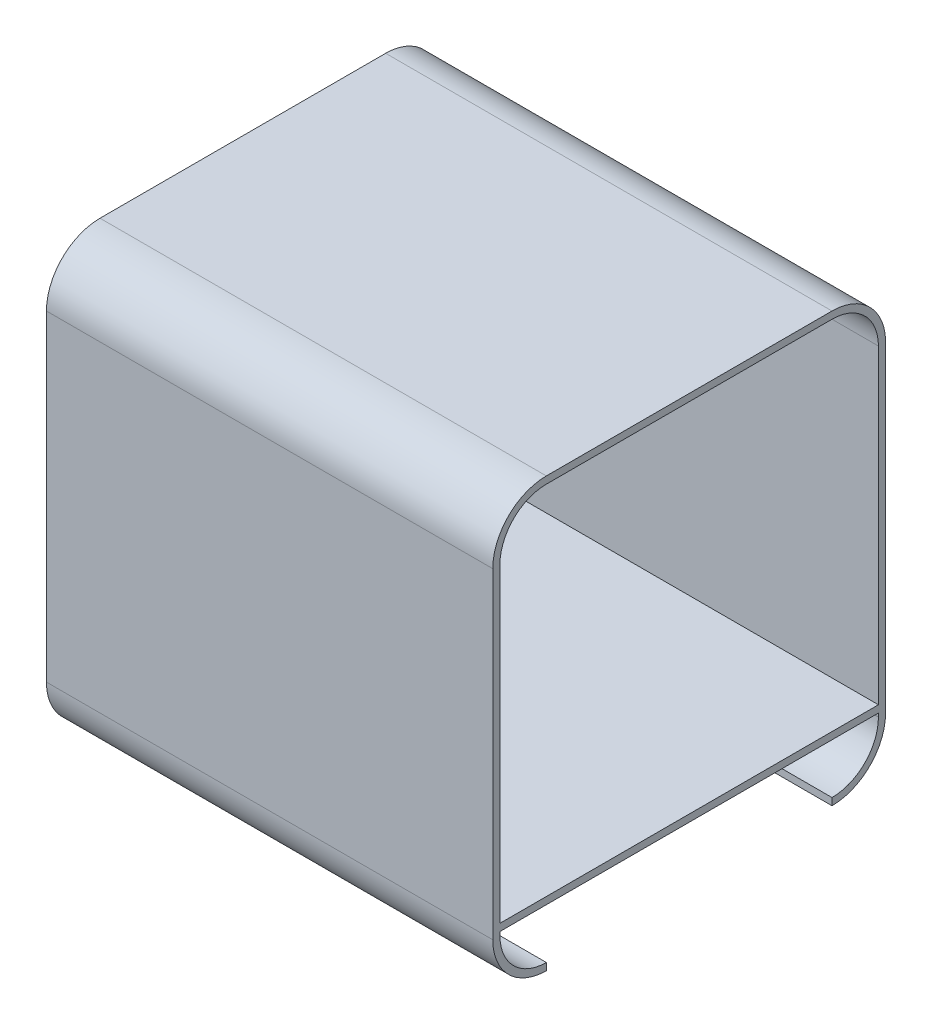
ISO-10303-21;
HEADER;
FILE_DESCRIPTION(('STEP AP214'),'2;1');
FILE_NAME('part.step','',(''),(''),'','','');
FILE_SCHEMA(('AUTOMOTIVE_DESIGN { 1 0 10303 214 1 1 1 1 }'));
ENDSEC;
DATA;
#1=APPLICATION_CONTEXT('core data for automotive mechanical design processes');
#2=APPLICATION_PROTOCOL_DEFINITION('international standard','automotive_design',2000,#1);
#3=PRODUCT_CONTEXT('',#1,'mechanical');
#4=PRODUCT('Part','Part','',(#3));
#5=PRODUCT_RELATED_PRODUCT_CATEGORY('part','',(#4));
#6=PRODUCT_DEFINITION_FORMATION('','',#4);
#7=PRODUCT_DEFINITION_CONTEXT('part definition',#1,'design');
#8=PRODUCT_DEFINITION('design','',#6,#7);
#9=PRODUCT_DEFINITION_SHAPE('','',#8);
#10=(LENGTH_UNIT() NAMED_UNIT(*) SI_UNIT(.MILLI.,.METRE.));
#11=(NAMED_UNIT(*) PLANE_ANGLE_UNIT() SI_UNIT($,.RADIAN.));
#12=(NAMED_UNIT(*) SI_UNIT($,.STERADIAN.) SOLID_ANGLE_UNIT());
#13=UNCERTAINTY_MEASURE_WITH_UNIT(LENGTH_MEASURE(1.E-05),#10,'distance_accuracy_value','');
#14=(GEOMETRIC_REPRESENTATION_CONTEXT(3) GLOBAL_UNCERTAINTY_ASSIGNED_CONTEXT((#13)) GLOBAL_UNIT_ASSIGNED_CONTEXT((#10,
#11,#12)) REPRESENTATION_CONTEXT('',''));
#15=CARTESIAN_POINT('',(0.,0.,0.));
#16=DIRECTION('',(0.,0.,1.));
#17=DIRECTION('',(1.,0.,0.));
#18=AXIS2_PLACEMENT_3D('',#15,#16,#17);
#19=CARTESIAN_POINT('',(3600.,1388.01094476767,-1100.));
#20=DIRECTION('',(-1.,0.,0.));
#21=DIRECTION('',(0.,0.,1.));
#22=AXIS2_PLACEMENT_3D('',#19,#20,#21);
#23=PLANE('',#22);
#24=DIRECTION('',(0.,0.,-1.));
#25=VECTOR('',#24,1.);
#26=CARTESIAN_POINT('',(3600.,1160.,1100.));
#27=LINE('',#26,#25);
#28=CARTESIAN_POINT('',(3600.,1160.,800.));
#29=VERTEX_POINT('',#28);
#30=CARTESIAN_POINT('',(3600.,1160.,-800.));
#31=VERTEX_POINT('',#30);
#32=EDGE_CURVE('E177',#29,#31,#27,.T.);
#33=ORIENTED_EDGE('',*,*,#32,.F.);
#34=CARTESIAN_POINT('',(3600.,900.,800.));
#35=DIRECTION('',(-1.,0.,0.));
#36=DIRECTION('',(0.,0.,1.));
#37=AXIS2_PLACEMENT_3D('',#34,#35,#36);
#38=CIRCLE('',#37,260.);
#39=CARTESIAN_POINT('',(3600.,900.,1060.));
#40=VERTEX_POINT('',#39);
#41=EDGE_CURVE('E190',#29,#40,#38,.F.);
#42=ORIENTED_EDGE('',*,*,#41,.T.);
#43=DIRECTION('',(0.,1.,0.));
#44=VECTOR('',#43,1.);
#45=CARTESIAN_POINT('',(3600.,1200.,1060.));
#46=LINE('',#45,#44);
#47=CARTESIAN_POINT('',(3600.,-840.,1060.));
#48=VERTEX_POINT('',#47);
#49=EDGE_CURVE('E262',#48,#40,#46,.T.);
#50=ORIENTED_EDGE('',*,*,#49,.F.);
#51=DIRECTION('',(0.,0.,1.));
#52=VECTOR('',#51,1.);
#53=CARTESIAN_POINT('',(3600.,-840.,-1060.));
#54=LINE('',#53,#52);
#55=CARTESIAN_POINT('',(3600.,-840.,-1060.));
#56=VERTEX_POINT('',#55);
#57=EDGE_CURVE('E39',#56,#48,#54,.T.);
#58=ORIENTED_EDGE('',*,*,#57,.F.);
#59=DIRECTION('',(0.,-1.,0.));
#60=VECTOR('',#59,1.);
#61=CARTESIAN_POINT('',(3600.,1200.,-1060.));
#62=LINE('',#61,#60);
#63=CARTESIAN_POINT('',(3600.,900.,-1060.));
#64=VERTEX_POINT('',#63);
#65=EDGE_CURVE('E264',#64,#56,#62,.T.);
#66=ORIENTED_EDGE('',*,*,#65,.F.);
#67=CARTESIAN_POINT('',(3600.,900.,-800.));
#68=DIRECTION('',(-1.,0.,0.));
#69=DIRECTION('',(0.,0.,1.));
#70=AXIS2_PLACEMENT_3D('',#67,#68,#69);
#71=CIRCLE('',#70,260.);
#72=EDGE_CURVE('E193',#64,#31,#71,.F.);
#73=ORIENTED_EDGE('',*,*,#72,.T.);
#74=EDGE_LOOP('',(#33,#42,#50,#58,#66,#73));
#75=FACE_BOUND('',#74,.T.);
#76=CARTESIAN_POINT('',(3600.,900.,-800.));
#77=DIRECTION('',(-1.,0.,0.));
#78=DIRECTION('',(0.,0.,1.));
#79=AXIS2_PLACEMENT_3D('',#76,#77,#78);
#80=CIRCLE('',#79,300.);
#81=CARTESIAN_POINT('',(3600.,900.,-1100.));
#82=VERTEX_POINT('',#81);
#83=CARTESIAN_POINT('',(3600.,1200.,-800.));
#84=VERTEX_POINT('',#83);
#85=EDGE_CURVE('E250',#82,#84,#80,.F.);
#86=ORIENTED_EDGE('',*,*,#85,.F.);
#87=DIRECTION('',(0.,-1.,0.));
#88=VECTOR('',#87,1.);
#89=CARTESIAN_POINT('',(3600.,1200.,-1100.));
#90=LINE('',#89,#88);
#91=CARTESIAN_POINT('',(3600.,-900.,-1100.));
#92=VERTEX_POINT('',#91);
#93=EDGE_CURVE('E235',#82,#92,#90,.T.);
#94=ORIENTED_EDGE('',*,*,#93,.T.);
#95=CARTESIAN_POINT('',(3600.,-900.,-800.));
#96=DIRECTION('',(-1.,0.,0.));
#97=DIRECTION('',(0.,0.,1.));
#98=AXIS2_PLACEMENT_3D('',#95,#96,#97);
#99=CIRCLE('',#98,300.);
#100=CARTESIAN_POINT('',(3600.,-1200.,-800.));
#101=VERTEX_POINT('',#100);
#102=EDGE_CURVE('E247',#101,#92,#99,.F.);
#103=ORIENTED_EDGE('',*,*,#102,.F.);
#104=DIRECTION('',(0.,1.,0.));
#105=VECTOR('',#104,1.);
#106=CARTESIAN_POINT('',(3600.,-1200.,-800.));
#107=LINE('',#106,#105);
#108=CARTESIAN_POINT('',(3600.,-1160.,-800.));
#109=VERTEX_POINT('',#108);
#110=EDGE_CURVE('E223',#101,#109,#107,.T.);
#111=ORIENTED_EDGE('',*,*,#110,.T.);
#112=CARTESIAN_POINT('',(3600.,-900.,-800.));
#113=DIRECTION('',(-1.,0.,0.));
#114=DIRECTION('',(0.,0.,1.));
#115=AXIS2_PLACEMENT_3D('',#112,#113,#114);
#116=CIRCLE('',#115,260.);
#117=CARTESIAN_POINT('',(3600.,-899.999999999999,-1060.));
#118=VERTEX_POINT('',#117);
#119=EDGE_CURVE('E215',#109,#118,#116,.F.);
#120=ORIENTED_EDGE('',*,*,#119,.T.);
#121=DIRECTION('',(0.,-1.,0.));
#122=VECTOR('',#121,1.);
#123=CARTESIAN_POINT('',(3600.,1200.,-1060.));
#124=LINE('',#123,#122);
#125=CARTESIAN_POINT('',(3600.,-880.,-1060.));
#126=VERTEX_POINT('',#125);
#127=EDGE_CURVE('E239',#126,#118,#124,.T.);
#128=ORIENTED_EDGE('',*,*,#127,.F.);
#129=DIRECTION('',(0.,0.,-1.));
#130=VECTOR('',#129,1.);
#131=CARTESIAN_POINT('',(3600.,-880.,-1060.));
#132=LINE('',#131,#130);
#133=CARTESIAN_POINT('',(3600.,-880.,1060.));
#134=VERTEX_POINT('',#133);
#135=EDGE_CURVE('E260',#134,#126,#132,.T.);
#136=ORIENTED_EDGE('',*,*,#135,.F.);
#137=DIRECTION('',(0.,1.,0.));
#138=VECTOR('',#137,1.);
#139=CARTESIAN_POINT('',(3600.,1200.,1060.));
#140=LINE('',#139,#138);
#141=CARTESIAN_POINT('',(3600.,-900.,1060.));
#142=VERTEX_POINT('',#141);
#143=EDGE_CURVE('E243',#142,#134,#140,.T.);
#144=ORIENTED_EDGE('',*,*,#143,.F.);
#145=CARTESIAN_POINT('',(3600.,-900.,800.));
#146=DIRECTION('',(-1.,0.,0.));
#147=DIRECTION('',(0.,0.,1.));
#148=AXIS2_PLACEMENT_3D('',#145,#146,#147);
#149=CIRCLE('',#148,260.);
#150=CARTESIAN_POINT('',(3600.,-1160.,800.));
#151=VERTEX_POINT('',#150);
#152=EDGE_CURVE('E211',#142,#151,#149,.F.);
#153=ORIENTED_EDGE('',*,*,#152,.T.);
#154=DIRECTION('',(0.,1.,0.));
#155=VECTOR('',#154,1.);
#156=CARTESIAN_POINT('',(3600.,-1200.,800.));
#157=LINE('',#156,#155);
#158=CARTESIAN_POINT('',(3600.,-1200.,800.));
#159=VERTEX_POINT('',#158);
#160=EDGE_CURVE('E219',#151,#159,#157,.F.);
#161=ORIENTED_EDGE('',*,*,#160,.T.);
#162=CARTESIAN_POINT('',(3600.,-900.,800.));
#163=DIRECTION('',(-1.,0.,0.));
#164=DIRECTION('',(0.,0.,1.));
#165=AXIS2_PLACEMENT_3D('',#162,#163,#164);
#166=CIRCLE('',#165,300.);
#167=CARTESIAN_POINT('',(3600.,-900.,1100.));
#168=VERTEX_POINT('',#167);
#169=EDGE_CURVE('E253',#168,#159,#166,.F.);
#170=ORIENTED_EDGE('',*,*,#169,.F.);
#171=DIRECTION('',(0.,1.,0.));
#172=VECTOR('',#171,1.);
#173=CARTESIAN_POINT('',(3600.,1200.,1100.));
#174=LINE('',#173,#172);
#175=CARTESIAN_POINT('',(3600.,900.,1100.));
#176=VERTEX_POINT('',#175);
#177=EDGE_CURVE('E231',#168,#176,#174,.T.);
#178=ORIENTED_EDGE('',*,*,#177,.T.);
#179=CARTESIAN_POINT('',(3600.,900.,800.));
#180=DIRECTION('',(-1.,0.,0.));
#181=DIRECTION('',(0.,0.,1.));
#182=AXIS2_PLACEMENT_3D('',#179,#180,#181);
#183=CIRCLE('',#182,300.);
#184=CARTESIAN_POINT('',(3600.,1200.,800.));
#185=VERTEX_POINT('',#184);
#186=EDGE_CURVE('E257',#185,#176,#183,.F.);
#187=ORIENTED_EDGE('',*,*,#186,.F.);
#188=DIRECTION('',(0.,0.,-1.));
#189=VECTOR('',#188,1.);
#190=CARTESIAN_POINT('',(3600.,1200.,1100.));
#191=LINE('',#190,#189);
#192=EDGE_CURVE('E227',#185,#84,#191,.T.);
#193=ORIENTED_EDGE('',*,*,#192,.T.);
#194=EDGE_LOOP('',(#86,#94,#103,#111,#120,#128,#136,#144,#153,#161,#170,#178,#187,#193));
#195=FACE_BOUND('',#194,.T.);
#196=ADVANCED_FACE('F35',(#75,#195),#23,.T.);
#197=CARTESIAN_POINT('',(6100.,1388.01094476767,-1100.));
#198=DIRECTION('',(1.,0.,0.));
#199=DIRECTION('',(0.,0.,-1.));
#200=AXIS2_PLACEMENT_3D('',#197,#198,#199);
#201=PLANE('',#200);
#202=DIRECTION('',(0.,0.,1.));
#203=VECTOR('',#202,1.);
#204=CARTESIAN_POINT('',(6100.,1160.,1100.));
#205=LINE('',#204,#203);
#206=CARTESIAN_POINT('',(6100.,1160.,-800.));
#207=VERTEX_POINT('',#206);
#208=CARTESIAN_POINT('',(6100.,1160.,800.));
#209=VERTEX_POINT('',#208);
#210=EDGE_CURVE('E180',#207,#209,#205,.T.);
#211=ORIENTED_EDGE('',*,*,#210,.F.);
#212=CARTESIAN_POINT('',(6100.,900.,-800.));
#213=DIRECTION('',(1.,0.,0.));
#214=DIRECTION('',(0.,0.,-1.));
#215=AXIS2_PLACEMENT_3D('',#212,#213,#214);
#216=CIRCLE('',#215,260.);
#217=CARTESIAN_POINT('',(6100.,900.,-1060.));
#218=VERTEX_POINT('',#217);
#219=EDGE_CURVE('E199',#207,#218,#216,.F.);
#220=ORIENTED_EDGE('',*,*,#219,.T.);
#221=DIRECTION('',(0.,1.,0.));
#222=VECTOR('',#221,1.);
#223=CARTESIAN_POINT('',(6100.,1200.,-1060.));
#224=LINE('',#223,#222);
#225=CARTESIAN_POINT('',(6100.,-840.,-1060.));
#226=VERTEX_POINT('',#225);
#227=EDGE_CURVE('E265',#226,#218,#224,.T.);
#228=ORIENTED_EDGE('',*,*,#227,.F.);
#229=DIRECTION('',(0.,0.,-1.));
#230=VECTOR('',#229,1.);
#231=CARTESIAN_POINT('',(6100.,-840.,-1060.));
#232=LINE('',#231,#230);
#233=CARTESIAN_POINT('',(6100.,-840.,1060.));
#234=VERTEX_POINT('',#233);
#235=EDGE_CURVE('E59',#234,#226,#232,.T.);
#236=ORIENTED_EDGE('',*,*,#235,.F.);
#237=DIRECTION('',(0.,-1.,0.));
#238=VECTOR('',#237,1.);
#239=CARTESIAN_POINT('',(6100.,1200.,1060.));
#240=LINE('',#239,#238);
#241=CARTESIAN_POINT('',(6100.,900.,1060.));
#242=VERTEX_POINT('',#241);
#243=EDGE_CURVE('E263',#242,#234,#240,.T.);
#244=ORIENTED_EDGE('',*,*,#243,.F.);
#245=CARTESIAN_POINT('',(6100.,900.,800.));
#246=DIRECTION('',(1.,0.,0.));
#247=DIRECTION('',(0.,0.,-1.));
#248=AXIS2_PLACEMENT_3D('',#245,#246,#247);
#249=CIRCLE('',#248,260.);
#250=EDGE_CURVE('E200',#242,#209,#249,.F.);
#251=ORIENTED_EDGE('',*,*,#250,.T.);
#252=EDGE_LOOP('',(#211,#220,#228,#236,#244,#251));
#253=FACE_BOUND('',#252,.T.);
#254=CARTESIAN_POINT('',(6100.,900.,-800.));
#255=DIRECTION('',(1.,0.,0.));
#256=DIRECTION('',(0.,0.,-1.));
#257=AXIS2_PLACEMENT_3D('',#254,#255,#256);
#258=CIRCLE('',#257,300.);
#259=CARTESIAN_POINT('',(6100.,1200.,-800.));
#260=VERTEX_POINT('',#259);
#261=CARTESIAN_POINT('',(6100.,900.,-1100.));
#262=VERTEX_POINT('',#261);
#263=EDGE_CURVE('E252',#260,#262,#258,.F.);
#264=ORIENTED_EDGE('',*,*,#263,.F.);
#265=DIRECTION('',(0.,0.,1.));
#266=VECTOR('',#265,1.);
#267=CARTESIAN_POINT('',(6100.,1200.,1100.));
#268=LINE('',#267,#266);
#269=CARTESIAN_POINT('',(6100.,1200.,800.));
#270=VERTEX_POINT('',#269);
#271=EDGE_CURVE('E226',#260,#270,#268,.T.);
#272=ORIENTED_EDGE('',*,*,#271,.T.);
#273=CARTESIAN_POINT('',(6100.,900.,800.));
#274=DIRECTION('',(1.,0.,0.));
#275=DIRECTION('',(0.,0.,-1.));
#276=AXIS2_PLACEMENT_3D('',#273,#274,#275);
#277=CIRCLE('',#276,300.);
#278=CARTESIAN_POINT('',(6100.,900.,1100.));
#279=VERTEX_POINT('',#278);
#280=EDGE_CURVE('E259',#279,#270,#277,.F.);
#281=ORIENTED_EDGE('',*,*,#280,.F.);
#282=DIRECTION('',(0.,-1.,0.));
#283=VECTOR('',#282,1.);
#284=CARTESIAN_POINT('',(6100.,1200.,1100.));
#285=LINE('',#284,#283);
#286=CARTESIAN_POINT('',(6100.,-900.,1100.));
#287=VERTEX_POINT('',#286);
#288=EDGE_CURVE('E230',#279,#287,#285,.T.);
#289=ORIENTED_EDGE('',*,*,#288,.T.);
#290=CARTESIAN_POINT('',(6100.,-900.,800.));
#291=DIRECTION('',(1.,0.,0.));
#292=DIRECTION('',(0.,0.,-1.));
#293=AXIS2_PLACEMENT_3D('',#290,#291,#292);
#294=CIRCLE('',#293,300.);
#295=CARTESIAN_POINT('',(6100.,-1200.,800.));
#296=VERTEX_POINT('',#295);
#297=EDGE_CURVE('E256',#296,#287,#294,.F.);
#298=ORIENTED_EDGE('',*,*,#297,.F.);
#299=DIRECTION('',(0.,-1.,0.));
#300=VECTOR('',#299,1.);
#301=CARTESIAN_POINT('',(6100.,-1200.,800.));
#302=LINE('',#301,#300);
#303=CARTESIAN_POINT('',(6100.,-1160.,800.));
#304=VERTEX_POINT('',#303);
#305=EDGE_CURVE('E218',#296,#304,#302,.F.);
#306=ORIENTED_EDGE('',*,*,#305,.T.);
#307=CARTESIAN_POINT('',(6100.,-900.,800.));
#308=DIRECTION('',(1.,0.,0.));
#309=DIRECTION('',(0.,0.,-1.));
#310=AXIS2_PLACEMENT_3D('',#307,#308,#309);
#311=CIRCLE('',#310,260.);
#312=CARTESIAN_POINT('',(6100.,-900.,1060.));
#313=VERTEX_POINT('',#312);
#314=EDGE_CURVE('E210',#304,#313,#311,.F.);
#315=ORIENTED_EDGE('',*,*,#314,.T.);
#316=DIRECTION('',(0.,-1.,0.));
#317=VECTOR('',#316,1.);
#318=CARTESIAN_POINT('',(6100.,1200.,1060.));
#319=LINE('',#318,#317);
#320=CARTESIAN_POINT('',(6100.,-880.,1060.));
#321=VERTEX_POINT('',#320);
#322=EDGE_CURVE('E246',#321,#313,#319,.T.);
#323=ORIENTED_EDGE('',*,*,#322,.F.);
#324=DIRECTION('',(0.,0.,1.));
#325=VECTOR('',#324,1.);
#326=CARTESIAN_POINT('',(6100.,-880.,-1060.));
#327=LINE('',#326,#325);
#328=CARTESIAN_POINT('',(6100.,-880.,-1060.));
#329=VERTEX_POINT('',#328);
#330=EDGE_CURVE('E194',#329,#321,#327,.T.);
#331=ORIENTED_EDGE('',*,*,#330,.F.);
#332=DIRECTION('',(0.,1.,0.));
#333=VECTOR('',#332,1.);
#334=CARTESIAN_POINT('',(6100.,1200.,-1060.));
#335=LINE('',#334,#333);
#336=CARTESIAN_POINT('',(6100.,-899.999999999999,-1060.));
#337=VERTEX_POINT('',#336);
#338=EDGE_CURVE('E242',#337,#329,#335,.T.);
#339=ORIENTED_EDGE('',*,*,#338,.F.);
#340=CARTESIAN_POINT('',(6100.,-900.,-800.));
#341=DIRECTION('',(1.,0.,0.));
#342=DIRECTION('',(0.,0.,-1.));
#343=AXIS2_PLACEMENT_3D('',#340,#341,#342);
#344=CIRCLE('',#343,260.);
#345=CARTESIAN_POINT('',(6100.,-1160.,-800.));
#346=VERTEX_POINT('',#345);
#347=EDGE_CURVE('E214',#337,#346,#344,.F.);
#348=ORIENTED_EDGE('',*,*,#347,.T.);
#349=DIRECTION('',(0.,-1.,0.));
#350=VECTOR('',#349,1.);
#351=CARTESIAN_POINT('',(6100.,-1200.,-800.));
#352=LINE('',#351,#350);
#353=CARTESIAN_POINT('',(6100.,-1200.,-800.));
#354=VERTEX_POINT('',#353);
#355=EDGE_CURVE('E222',#346,#354,#352,.T.);
#356=ORIENTED_EDGE('',*,*,#355,.T.);
#357=CARTESIAN_POINT('',(6100.,-900.,-800.));
#358=DIRECTION('',(1.,0.,0.));
#359=DIRECTION('',(0.,0.,-1.));
#360=AXIS2_PLACEMENT_3D('',#357,#358,#359);
#361=CIRCLE('',#360,300.);
#362=CARTESIAN_POINT('',(6100.,-900.,-1100.));
#363=VERTEX_POINT('',#362);
#364=EDGE_CURVE('E249',#363,#354,#361,.F.);
#365=ORIENTED_EDGE('',*,*,#364,.F.);
#366=DIRECTION('',(0.,1.,0.));
#367=VECTOR('',#366,1.);
#368=CARTESIAN_POINT('',(6100.,1200.,-1100.));
#369=LINE('',#368,#367);
#370=EDGE_CURVE('E234',#363,#262,#369,.T.);
#371=ORIENTED_EDGE('',*,*,#370,.T.);
#372=EDGE_LOOP('',(#264,#272,#281,#289,#298,#306,#315,#323,#331,#339,#348,#356,#365,#371));
#373=FACE_BOUND('',#372,.T.);
#374=ADVANCED_FACE('F333',(#253,#373),#201,.T.);
#375=CARTESIAN_POINT('',(9000.,1160.,1100.));
#376=DIRECTION('',(0.,-1.,0.));
#377=DIRECTION('',(0.,0.,-1.));
#378=AXIS2_PLACEMENT_3D('',#375,#376,#377);
#379=PLANE('',#378);
#380=DIRECTION('',(1.,0.,0.));
#381=VECTOR('',#380,1.);
#382=CARTESIAN_POINT('',(9000.,1160.,800.));
#383=LINE('',#382,#381);
#384=EDGE_CURVE('E174',#29,#209,#383,.T.);
#385=ORIENTED_EDGE('',*,*,#384,.F.);
#386=ORIENTED_EDGE('',*,*,#32,.T.);
#387=DIRECTION('',(1.,0.,0.));
#388=VECTOR('',#387,1.);
#389=CARTESIAN_POINT('',(9000.,1160.,-800.));
#390=LINE('',#389,#388);
#391=EDGE_CURVE('E186',#207,#31,#390,.F.);
#392=ORIENTED_EDGE('',*,*,#391,.F.);
#393=ORIENTED_EDGE('',*,*,#210,.T.);
#394=EDGE_LOOP('',(#385,#386,#392,#393));
#395=FACE_BOUND('',#394,.T.);
#396=ADVANCED_FACE('F176',(#395),#379,.T.);
#397=CARTESIAN_POINT('',(9000.,900.,800.));
#398=DIRECTION('',(-1.,0.,0.));
#399=DIRECTION('',(0.,0.,1.));
#400=AXIS2_PLACEMENT_3D('',#397,#398,#399);
#401=CYLINDRICAL_SURFACE('',#400,260.);
#402=ORIENTED_EDGE('',*,*,#41,.F.);
#403=ORIENTED_EDGE('',*,*,#384,.T.);
#404=ORIENTED_EDGE('',*,*,#250,.F.);
#405=DIRECTION('',(1.,0.,0.));
#406=VECTOR('',#405,1.);
#407=CARTESIAN_POINT('',(9000.,900.,1060.));
#408=LINE('',#407,#406);
#409=EDGE_CURVE('E198',#242,#40,#408,.F.);
#410=ORIENTED_EDGE('',*,*,#409,.T.);
#411=EDGE_LOOP('',(#402,#403,#404,#410));
#412=FACE_BOUND('',#411,.T.);
#413=ADVANCED_FACE('F196',(#412),#401,.F.);
#414=CARTESIAN_POINT('',(9000.,900.,-800.));
#415=DIRECTION('',(-1.,0.,0.));
#416=DIRECTION('',(0.,0.,1.));
#417=AXIS2_PLACEMENT_3D('',#414,#415,#416);
#418=CYLINDRICAL_SURFACE('',#417,260.);
#419=ORIENTED_EDGE('',*,*,#72,.F.);
#420=DIRECTION('',(1.,0.,0.));
#421=VECTOR('',#420,1.);
#422=CARTESIAN_POINT('',(9000.,900.,-1060.));
#423=LINE('',#422,#421);
#424=EDGE_CURVE('E287',#64,#218,#423,.T.);
#425=ORIENTED_EDGE('',*,*,#424,.T.);
#426=ORIENTED_EDGE('',*,*,#219,.F.);
#427=ORIENTED_EDGE('',*,*,#391,.T.);
#428=EDGE_LOOP('',(#419,#425,#426,#427));
#429=FACE_BOUND('',#428,.T.);
#430=ADVANCED_FACE('F414',(#429),#418,.F.);
#431=CARTESIAN_POINT('',(9000.,1200.,1060.));
#432=DIRECTION('',(0.,0.,-1.));
#433=DIRECTION('',(0.,1.,0.));
#434=AXIS2_PLACEMENT_3D('',#431,#432,#433);
#435=PLANE('',#434);
#436=DIRECTION('',(1.,0.,0.));
#437=VECTOR('',#436,1.);
#438=CARTESIAN_POINT('',(-0.00199999999983547,-840.,1060.));
#439=LINE('',#438,#437);
#440=EDGE_CURVE('E280',#48,#234,#439,.T.);
#441=ORIENTED_EDGE('',*,*,#440,.F.);
#442=ORIENTED_EDGE('',*,*,#49,.T.);
#443=ORIENTED_EDGE('',*,*,#409,.F.);
#444=ORIENTED_EDGE('',*,*,#243,.T.);
#445=EDGE_LOOP('',(#441,#442,#443,#444));
#446=FACE_BOUND('',#445,.T.);
#447=ADVANCED_FACE('F403',(#446),#435,.T.);
#448=CARTESIAN_POINT('',(9000.,1200.,-1060.));
#449=DIRECTION('',(0.,0.,1.));
#450=DIRECTION('',(0.,-1.,0.));
#451=AXIS2_PLACEMENT_3D('',#448,#449,#450);
#452=PLANE('',#451);
#453=ORIENTED_EDGE('',*,*,#424,.F.);
#454=ORIENTED_EDGE('',*,*,#65,.T.);
#455=DIRECTION('',(1.,0.,0.));
#456=VECTOR('',#455,1.);
#457=CARTESIAN_POINT('',(-0.00199999999983547,-840.,-1060.));
#458=LINE('',#457,#456);
#459=EDGE_CURVE('E282',#56,#226,#458,.T.);
#460=ORIENTED_EDGE('',*,*,#459,.T.);
#461=ORIENTED_EDGE('',*,*,#227,.T.);
#462=EDGE_LOOP('',(#453,#454,#460,#461));
#463=FACE_BOUND('',#462,.T.);
#464=ADVANCED_FACE('F397',(#463),#452,.T.);
#465=CARTESIAN_POINT('',(-0.00199999999983547,-840.,-1060.));
#466=DIRECTION('',(0.,1.,0.));
#467=DIRECTION('',(0.,0.,1.));
#468=AXIS2_PLACEMENT_3D('',#465,#466,#467);
#469=PLANE('',#468);
#470=ORIENTED_EDGE('',*,*,#459,.F.);
#471=ORIENTED_EDGE('',*,*,#57,.T.);
#472=ORIENTED_EDGE('',*,*,#440,.T.);
#473=ORIENTED_EDGE('',*,*,#235,.T.);
#474=EDGE_LOOP('',(#470,#471,#472,#473));
#475=FACE_BOUND('',#474,.T.);
#476=ADVANCED_FACE('F407',(#475),#469,.T.);
#477=CARTESIAN_POINT('',(9000.,1200.,1100.));
#478=DIRECTION('',(0.,0.,-1.));
#479=DIRECTION('',(0.,1.,0.));
#480=AXIS2_PLACEMENT_3D('',#477,#478,#479);
#481=PLANE('',#480);
#482=ORIENTED_EDGE('',*,*,#177,.F.);
#483=DIRECTION('',(-1.,0.,0.));
#484=VECTOR('',#483,1.);
#485=CARTESIAN_POINT('',(9000.,-900.,1100.));
#486=LINE('',#485,#484);
#487=EDGE_CURVE('E299',#168,#287,#486,.F.);
#488=ORIENTED_EDGE('',*,*,#487,.T.);
#489=ORIENTED_EDGE('',*,*,#288,.F.);
#490=DIRECTION('',(-1.,0.,0.));
#491=VECTOR('',#490,1.);
#492=CARTESIAN_POINT('',(9000.,900.,1100.));
#493=LINE('',#492,#491);
#494=EDGE_CURVE('E296',#279,#176,#493,.T.);
#495=ORIENTED_EDGE('',*,*,#494,.T.);
#496=EDGE_LOOP('',(#482,#488,#489,#495));
#497=FACE_BOUND('',#496,.T.);
#498=ADVANCED_FACE('F371',(#497),#481,.F.);
#499=CARTESIAN_POINT('',(9000.,1200.,1100.));
#500=DIRECTION('',(0.,-1.,0.));
#501=DIRECTION('',(0.,0.,-1.));
#502=AXIS2_PLACEMENT_3D('',#499,#500,#501);
#503=PLANE('',#502);
#504=ORIENTED_EDGE('',*,*,#192,.F.);
#505=DIRECTION('',(-1.,0.,0.));
#506=VECTOR('',#505,1.);
#507=CARTESIAN_POINT('',(9000.,1200.,800.));
#508=LINE('',#507,#506);
#509=EDGE_CURVE('E311',#185,#270,#508,.F.);
#510=ORIENTED_EDGE('',*,*,#509,.T.);
#511=ORIENTED_EDGE('',*,*,#271,.F.);
#512=DIRECTION('',(-1.,0.,0.));
#513=VECTOR('',#512,1.);
#514=CARTESIAN_POINT('',(9000.,1200.,-800.));
#515=LINE('',#514,#513);
#516=EDGE_CURVE('E207',#260,#84,#515,.T.);
#517=ORIENTED_EDGE('',*,*,#516,.T.);
#518=EDGE_LOOP('',(#504,#510,#511,#517));
#519=FACE_BOUND('',#518,.T.);
#520=ADVANCED_FACE('F319',(#519),#503,.F.);
#521=CARTESIAN_POINT('',(9000.,900.,800.));
#522=DIRECTION('',(-1.,0.,0.));
#523=DIRECTION('',(0.,0.,1.));
#524=AXIS2_PLACEMENT_3D('',#521,#522,#523);
#525=CYLINDRICAL_SURFACE('',#524,300.);
#526=ORIENTED_EDGE('',*,*,#509,.F.);
#527=ORIENTED_EDGE('',*,*,#186,.T.);
#528=ORIENTED_EDGE('',*,*,#494,.F.);
#529=ORIENTED_EDGE('',*,*,#280,.T.);
#530=EDGE_LOOP('',(#526,#527,#528,#529));
#531=FACE_BOUND('',#530,.T.);
#532=ADVANCED_FACE('F328',(#531),#525,.T.);
#533=CARTESIAN_POINT('',(9000.,-900.,-800.));
#534=DIRECTION('',(-1.,0.,0.));
#535=DIRECTION('',(0.,0.,1.));
#536=AXIS2_PLACEMENT_3D('',#533,#534,#535);
#537=CYLINDRICAL_SURFACE('',#536,300.);
#538=DIRECTION('',(-1.,0.,0.));
#539=VECTOR('',#538,1.);
#540=CARTESIAN_POINT('',(9000.,-1200.,-800.));
#541=LINE('',#540,#539);
#542=EDGE_CURVE('E302',#101,#354,#541,.F.);
#543=ORIENTED_EDGE('',*,*,#542,.F.);
#544=ORIENTED_EDGE('',*,*,#102,.T.);
#545=DIRECTION('',(-1.,0.,0.));
#546=VECTOR('',#545,1.);
#547=CARTESIAN_POINT('',(9000.,-900.,-1100.));
#548=LINE('',#547,#546);
#549=EDGE_CURVE('E309',#363,#92,#548,.T.);
#550=ORIENTED_EDGE('',*,*,#549,.F.);
#551=ORIENTED_EDGE('',*,*,#364,.T.);
#552=EDGE_LOOP('',(#543,#544,#550,#551));
#553=FACE_BOUND('',#552,.T.);
#554=ADVANCED_FACE('F389',(#553),#537,.T.);
#555=CARTESIAN_POINT('',(9000.,-900.,800.));
#556=DIRECTION('',(-1.,0.,0.));
#557=DIRECTION('',(0.,0.,1.));
#558=AXIS2_PLACEMENT_3D('',#555,#556,#557);
#559=CYLINDRICAL_SURFACE('',#558,300.);
#560=ORIENTED_EDGE('',*,*,#487,.F.);
#561=ORIENTED_EDGE('',*,*,#169,.T.);
#562=DIRECTION('',(-1.,0.,0.));
#563=VECTOR('',#562,1.);
#564=CARTESIAN_POINT('',(9000.,-1200.,800.));
#565=LINE('',#564,#563);
#566=EDGE_CURVE('E304',#296,#159,#565,.T.);
#567=ORIENTED_EDGE('',*,*,#566,.F.);
#568=ORIENTED_EDGE('',*,*,#297,.T.);
#569=EDGE_LOOP('',(#560,#561,#567,#568));
#570=FACE_BOUND('',#569,.T.);
#571=ADVANCED_FACE('F372',(#570),#559,.T.);
#572=CARTESIAN_POINT('',(9000.,-1200.,800.));
#573=DIRECTION('',(0.,0.,-1.));
#574=DIRECTION('',(-1.,0.,0.));
#575=AXIS2_PLACEMENT_3D('',#572,#573,#574);
#576=PLANE('',#575);
#577=ORIENTED_EDGE('',*,*,#160,.F.);
#578=DIRECTION('',(-1.,0.,0.));
#579=VECTOR('',#578,1.);
#580=CARTESIAN_POINT('',(9000.,-1160.,800.));
#581=LINE('',#580,#579);
#582=EDGE_CURVE('E292',#304,#151,#581,.T.);
#583=ORIENTED_EDGE('',*,*,#582,.F.);
#584=ORIENTED_EDGE('',*,*,#305,.F.);
#585=ORIENTED_EDGE('',*,*,#566,.T.);
#586=EDGE_LOOP('',(#577,#583,#584,#585));
#587=FACE_BOUND('',#586,.T.);
#588=ADVANCED_FACE('F367',(#587),#576,.T.);
#589=DIRECTION('',(1.,0.,0.));
#590=VECTOR('',#589,1.);
#591=CARTESIAN_POINT('',(-0.00199999999983547,-880.,-1060.));
#592=LINE('',#591,#590);
#593=EDGE_CURVE('E11',#126,#329,#592,.T.);
#594=ORIENTED_EDGE('',*,*,#593,.F.);
#595=ORIENTED_EDGE('',*,*,#127,.T.);
#596=DIRECTION('',(1.,0.,0.));
#597=VECTOR('',#596,1.);
#598=CARTESIAN_POINT('',(9000.,-899.999999999999,-1060.));
#599=LINE('',#598,#597);
#600=EDGE_CURVE('E185',#337,#118,#599,.F.);
#601=ORIENTED_EDGE('',*,*,#600,.F.);
#602=ORIENTED_EDGE('',*,*,#338,.T.);
#603=EDGE_LOOP('',(#594,#595,#601,#602));
#604=FACE_BOUND('',#603,.T.);
#605=ADVANCED_FACE('F394',(#604),#452,.T.);
#606=DIRECTION('',(1.,0.,0.));
#607=VECTOR('',#606,1.);
#608=CARTESIAN_POINT('',(9000.,-900.,1060.));
#609=LINE('',#608,#607);
#610=EDGE_CURVE('E285',#142,#313,#609,.T.);
#611=ORIENTED_EDGE('',*,*,#610,.F.);
#612=ORIENTED_EDGE('',*,*,#143,.T.);
#613=DIRECTION('',(1.,0.,0.));
#614=VECTOR('',#613,1.);
#615=CARTESIAN_POINT('',(-0.00199999999983547,-880.,1060.));
#616=LINE('',#615,#614);
#617=EDGE_CURVE('E44',#134,#321,#616,.T.);
#618=ORIENTED_EDGE('',*,*,#617,.T.);
#619=ORIENTED_EDGE('',*,*,#322,.T.);
#620=EDGE_LOOP('',(#611,#612,#618,#619));
#621=FACE_BOUND('',#620,.T.);
#622=ADVANCED_FACE('F358',(#621),#435,.T.);
#623=CARTESIAN_POINT('',(-0.00199999999983547,-880.,-1060.));
#624=DIRECTION('',(0.,-1.,0.));
#625=DIRECTION('',(0.,0.,-1.));
#626=AXIS2_PLACEMENT_3D('',#623,#624,#625);
#627=PLANE('',#626);
#628=ORIENTED_EDGE('',*,*,#617,.F.);
#629=ORIENTED_EDGE('',*,*,#135,.T.);
#630=ORIENTED_EDGE('',*,*,#593,.T.);
#631=ORIENTED_EDGE('',*,*,#330,.T.);
#632=EDGE_LOOP('',(#628,#629,#630,#631));
#633=FACE_BOUND('',#632,.T.);
#634=ADVANCED_FACE('F351',(#633),#627,.T.);
#635=CARTESIAN_POINT('',(9000.,-900.,800.));
#636=DIRECTION('',(-1.,0.,0.));
#637=DIRECTION('',(0.,0.,1.));
#638=AXIS2_PLACEMENT_3D('',#635,#636,#637);
#639=CYLINDRICAL_SURFACE('',#638,260.);
#640=ORIENTED_EDGE('',*,*,#152,.F.);
#641=ORIENTED_EDGE('',*,*,#610,.T.);
#642=ORIENTED_EDGE('',*,*,#314,.F.);
#643=ORIENTED_EDGE('',*,*,#582,.T.);
#644=EDGE_LOOP('',(#640,#641,#642,#643));
#645=FACE_BOUND('',#644,.T.);
#646=ADVANCED_FACE('F363',(#645),#639,.F.);
#647=CARTESIAN_POINT('',(9000.,-1200.,-800.));
#648=DIRECTION('',(0.,0.,-1.));
#649=DIRECTION('',(-1.,0.,0.));
#650=AXIS2_PLACEMENT_3D('',#647,#648,#649);
#651=PLANE('',#650);
#652=ORIENTED_EDGE('',*,*,#110,.F.);
#653=ORIENTED_EDGE('',*,*,#542,.T.);
#654=ORIENTED_EDGE('',*,*,#355,.F.);
#655=DIRECTION('',(-1.,0.,0.));
#656=VECTOR('',#655,1.);
#657=CARTESIAN_POINT('',(9000.,-1160.,-800.));
#658=LINE('',#657,#656);
#659=EDGE_CURVE('E294',#109,#346,#658,.F.);
#660=ORIENTED_EDGE('',*,*,#659,.F.);
#661=EDGE_LOOP('',(#652,#653,#654,#660));
#662=FACE_BOUND('',#661,.T.);
#663=ADVANCED_FACE('F385',(#662),#651,.F.);
#664=CARTESIAN_POINT('',(9000.,-900.,-800.));
#665=DIRECTION('',(-1.,0.,0.));
#666=DIRECTION('',(0.,0.,1.));
#667=AXIS2_PLACEMENT_3D('',#664,#665,#666);
#668=CYLINDRICAL_SURFACE('',#667,260.);
#669=ORIENTED_EDGE('',*,*,#119,.F.);
#670=ORIENTED_EDGE('',*,*,#659,.T.);
#671=ORIENTED_EDGE('',*,*,#347,.F.);
#672=ORIENTED_EDGE('',*,*,#600,.T.);
#673=EDGE_LOOP('',(#669,#670,#671,#672));
#674=FACE_BOUND('',#673,.T.);
#675=ADVANCED_FACE('F382',(#674),#668,.F.);
#676=CARTESIAN_POINT('',(9000.,1200.,-1100.));
#677=DIRECTION('',(0.,0.,1.));
#678=DIRECTION('',(0.,-1.,0.));
#679=AXIS2_PLACEMENT_3D('',#676,#677,#678);
#680=PLANE('',#679);
#681=ORIENTED_EDGE('',*,*,#93,.F.);
#682=DIRECTION('',(-1.,0.,0.));
#683=VECTOR('',#682,1.);
#684=CARTESIAN_POINT('',(9000.,900.,-1100.));
#685=LINE('',#684,#683);
#686=EDGE_CURVE('E306',#82,#262,#685,.F.);
#687=ORIENTED_EDGE('',*,*,#686,.T.);
#688=ORIENTED_EDGE('',*,*,#370,.F.);
#689=ORIENTED_EDGE('',*,*,#549,.T.);
#690=EDGE_LOOP('',(#681,#687,#688,#689));
#691=FACE_BOUND('',#690,.T.);
#692=ADVANCED_FACE('F392',(#691),#680,.F.);
#693=CARTESIAN_POINT('',(9000.,900.,-800.));
#694=DIRECTION('',(-1.,0.,0.));
#695=DIRECTION('',(0.,0.,1.));
#696=AXIS2_PLACEMENT_3D('',#693,#694,#695);
#697=CYLINDRICAL_SURFACE('',#696,300.);
#698=ORIENTED_EDGE('',*,*,#686,.F.);
#699=ORIENTED_EDGE('',*,*,#85,.T.);
#700=ORIENTED_EDGE('',*,*,#516,.F.);
#701=ORIENTED_EDGE('',*,*,#263,.T.);
#702=EDGE_LOOP('',(#698,#699,#700,#701));
#703=FACE_BOUND('',#702,.T.);
#704=ADVANCED_FACE('F37',(#703),#697,.T.);
#705=CLOSED_SHELL('',(#196,#374,#396,#413,#430,#447,#464,#476,#498,#520,#532,#554,#571,#588,
#605,#622,#634,#646,#663,#675,#692,#704));
#706=MANIFOLD_SOLID_BREP('B2',#705);
#707=ADVANCED_BREP_SHAPE_REPRESENTATION('',(#18,#706),#14);
#708=SHAPE_DEFINITION_REPRESENTATION(#9,#707);
ENDSEC;
END-ISO-10303-21;
